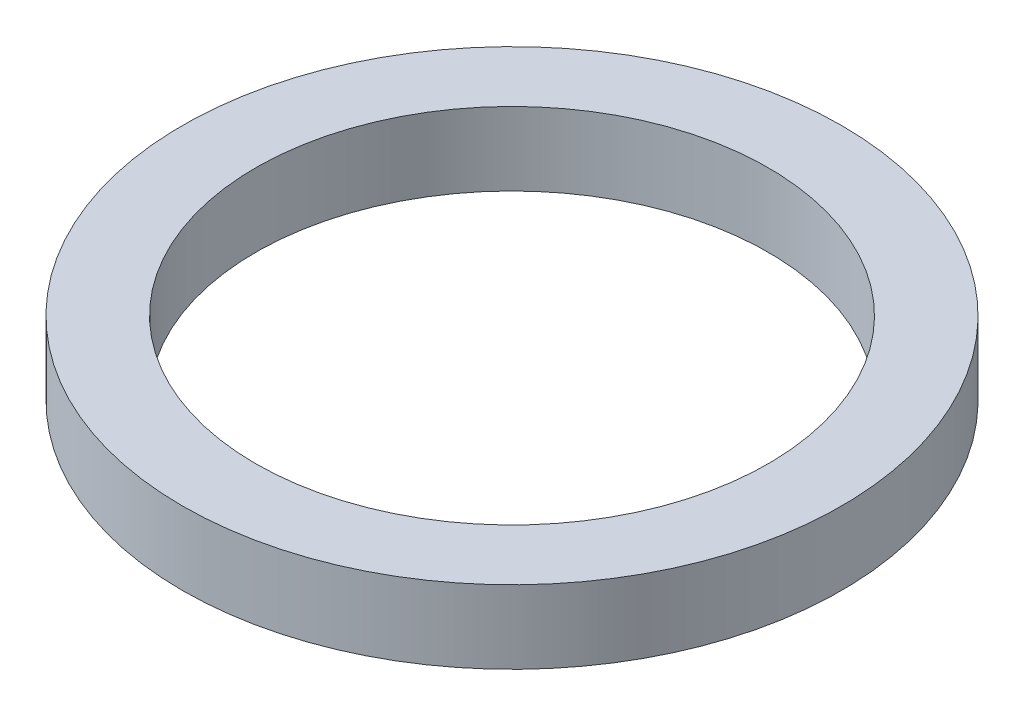
ISO-10303-21;
HEADER;
FILE_DESCRIPTION(('STEP AP214'),'2;1');
FILE_NAME('part.step','',(''),(''),'','','');
FILE_SCHEMA(('AUTOMOTIVE_DESIGN { 1 0 10303 214 1 1 1 1 }'));
ENDSEC;
DATA;
#1=APPLICATION_CONTEXT('core data for automotive mechanical design processes');
#2=APPLICATION_PROTOCOL_DEFINITION('international standard','automotive_design',2000,#1);
#3=PRODUCT_CONTEXT('',#1,'mechanical');
#4=PRODUCT('Part','Part','',(#3));
#5=PRODUCT_RELATED_PRODUCT_CATEGORY('part','',(#4));
#6=PRODUCT_DEFINITION_FORMATION('','',#4);
#7=PRODUCT_DEFINITION_CONTEXT('part definition',#1,'design');
#8=PRODUCT_DEFINITION('design','',#6,#7);
#9=PRODUCT_DEFINITION_SHAPE('','',#8);
#10=(LENGTH_UNIT() NAMED_UNIT(*) SI_UNIT(.MILLI.,.METRE.));
#11=(NAMED_UNIT(*) PLANE_ANGLE_UNIT() SI_UNIT($,.RADIAN.));
#12=(NAMED_UNIT(*) SI_UNIT($,.STERADIAN.) SOLID_ANGLE_UNIT());
#13=UNCERTAINTY_MEASURE_WITH_UNIT(LENGTH_MEASURE(1.E-05),#10,'distance_accuracy_value','');
#14=(GEOMETRIC_REPRESENTATION_CONTEXT(3) GLOBAL_UNCERTAINTY_ASSIGNED_CONTEXT((#13)) GLOBAL_UNIT_ASSIGNED_CONTEXT((#10,
#11,#12)) REPRESENTATION_CONTEXT('',''));
#15=CARTESIAN_POINT('',(0.,0.,0.));
#16=DIRECTION('',(0.,0.,1.));
#17=DIRECTION('',(1.,0.,0.));
#18=AXIS2_PLACEMENT_3D('',#15,#16,#17);
#19=CARTESIAN_POINT('',(0.,5.,0.));
#20=DIRECTION('',(0.,1.,0.));
#21=DIRECTION('',(0.,0.,1.));
#22=AXIS2_PLACEMENT_3D('',#19,#20,#21);
#23=PLANE('',#22);
#24=CARTESIAN_POINT('',(0.,5.,0.));
#25=DIRECTION('',(0.,1.,0.));
#26=DIRECTION('',(0.,0.,1.));
#27=AXIS2_PLACEMENT_3D('',#24,#25,#26);
#28=CIRCLE('',#27,22.5);
#29=CARTESIAN_POINT('',(0.,5.,22.5));
#30=VERTEX_POINT('',#29);
#31=EDGE_CURVE('E10',#30,#30,#28,.T.);
#32=ORIENTED_EDGE('',*,*,#31,.T.);
#33=EDGE_LOOP('',(#32));
#34=FACE_BOUND('',#33,.T.);
#35=CARTESIAN_POINT('',(0.,5.,0.));
#36=DIRECTION('',(0.,1.,0.));
#37=DIRECTION('',(0.,0.,1.));
#38=AXIS2_PLACEMENT_3D('',#35,#36,#37);
#39=CIRCLE('',#38,17.5);
#40=CARTESIAN_POINT('',(0.,5.,17.5));
#41=VERTEX_POINT('',#40);
#42=EDGE_CURVE('E59',#41,#41,#39,.T.);
#43=ORIENTED_EDGE('',*,*,#42,.F.);
#44=EDGE_LOOP('',(#43));
#45=FACE_BOUND('',#44,.T.);
#46=ADVANCED_FACE('F44',(#34,#45),#23,.T.);
#47=CARTESIAN_POINT('',(0.,0.,0.));
#48=DIRECTION('',(0.,1.,0.));
#49=DIRECTION('',(0.,0.,1.));
#50=AXIS2_PLACEMENT_3D('',#47,#48,#49);
#51=PLANE('',#50);
#52=CARTESIAN_POINT('',(0.,0.,0.));
#53=DIRECTION('',(0.,1.,0.));
#54=DIRECTION('',(0.,0.,1.));
#55=AXIS2_PLACEMENT_3D('',#52,#53,#54);
#56=CIRCLE('',#55,22.5);
#57=CARTESIAN_POINT('',(0.,0.,22.5));
#58=VERTEX_POINT('',#57);
#59=EDGE_CURVE('E47',#58,#58,#56,.T.);
#60=ORIENTED_EDGE('',*,*,#59,.F.);
#61=EDGE_LOOP('',(#60));
#62=FACE_BOUND('',#61,.T.);
#63=CARTESIAN_POINT('',(0.,0.,0.));
#64=DIRECTION('',(0.,1.,0.));
#65=DIRECTION('',(0.,0.,1.));
#66=AXIS2_PLACEMENT_3D('',#63,#64,#65);
#67=CIRCLE('',#66,17.5);
#68=CARTESIAN_POINT('',(0.,0.,17.5));
#69=VERTEX_POINT('',#68);
#70=EDGE_CURVE('E58',#69,#69,#67,.T.);
#71=ORIENTED_EDGE('',*,*,#70,.T.);
#72=EDGE_LOOP('',(#71));
#73=FACE_BOUND('',#72,.T.);
#74=ADVANCED_FACE('F74',(#62,#73),#51,.F.);
#75=CARTESIAN_POINT('',(0.,5.,0.));
#76=DIRECTION('',(0.,-1.,0.));
#77=DIRECTION('',(0.,0.,-1.));
#78=AXIS2_PLACEMENT_3D('',#75,#76,#77);
#79=CYLINDRICAL_SURFACE('',#78,22.5);
#80=ORIENTED_EDGE('',*,*,#31,.F.);
#81=EDGE_LOOP('',(#80));
#82=FACE_BOUND('',#81,.T.);
#83=ORIENTED_EDGE('',*,*,#59,.T.);
#84=EDGE_LOOP('',(#83));
#85=FACE_BOUND('',#84,.T.);
#86=ADVANCED_FACE('F50',(#82,#85),#79,.T.);
#87=CARTESIAN_POINT('',(0.,5.,0.));
#88=DIRECTION('',(0.,-1.,0.));
#89=DIRECTION('',(0.,0.,-1.));
#90=AXIS2_PLACEMENT_3D('',#87,#88,#89);
#91=CYLINDRICAL_SURFACE('',#90,17.5);
#92=ORIENTED_EDGE('',*,*,#42,.T.);
#93=EDGE_LOOP('',(#92));
#94=FACE_BOUND('',#93,.T.);
#95=ORIENTED_EDGE('',*,*,#70,.F.);
#96=EDGE_LOOP('',(#95));
#97=FACE_BOUND('',#96,.T.);
#98=ADVANCED_FACE('F66',(#94,#97),#91,.F.);
#99=CLOSED_SHELL('',(#46,#74,#86,#98));
#100=MANIFOLD_SOLID_BREP('B2',#99);
#101=ADVANCED_BREP_SHAPE_REPRESENTATION('',(#18,#100),#14);
#102=SHAPE_DEFINITION_REPRESENTATION(#9,#101);
ENDSEC;
END-ISO-10303-21;
